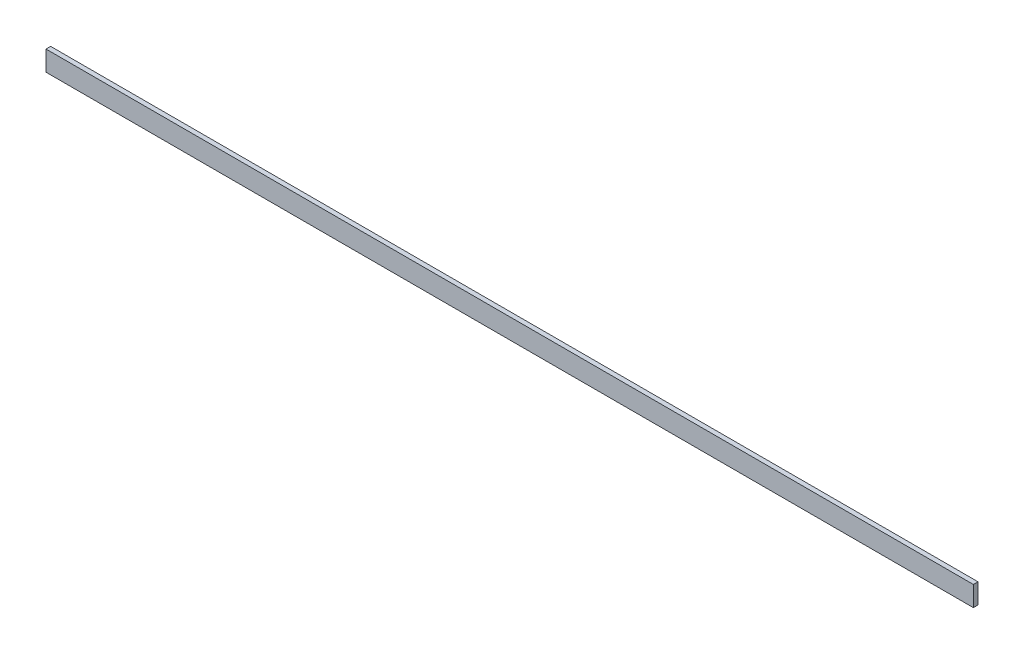
ISO-10303-21;
HEADER;
FILE_DESCRIPTION(('STEP AP214'),'2;1');
FILE_NAME('part.step','',(''),(''),'','','');
FILE_SCHEMA(('AUTOMOTIVE_DESIGN { 1 0 10303 214 1 1 1 1 }'));
ENDSEC;
DATA;
#1=APPLICATION_CONTEXT('core data for automotive mechanical design processes');
#2=APPLICATION_PROTOCOL_DEFINITION('international standard','automotive_design',2000,#1);
#3=PRODUCT_CONTEXT('',#1,'mechanical');
#4=PRODUCT('Part','Part','',(#3));
#5=PRODUCT_RELATED_PRODUCT_CATEGORY('part','',(#4));
#6=PRODUCT_DEFINITION_FORMATION('','',#4);
#7=PRODUCT_DEFINITION_CONTEXT('part definition',#1,'design');
#8=PRODUCT_DEFINITION('design','',#6,#7);
#9=PRODUCT_DEFINITION_SHAPE('','',#8);
#10=(LENGTH_UNIT() NAMED_UNIT(*) SI_UNIT(.MILLI.,.METRE.));
#11=(NAMED_UNIT(*) PLANE_ANGLE_UNIT() SI_UNIT($,.RADIAN.));
#12=(NAMED_UNIT(*) SI_UNIT($,.STERADIAN.) SOLID_ANGLE_UNIT());
#13=UNCERTAINTY_MEASURE_WITH_UNIT(LENGTH_MEASURE(1.E-05),#10,'distance_accuracy_value','');
#14=(GEOMETRIC_REPRESENTATION_CONTEXT(3) GLOBAL_UNCERTAINTY_ASSIGNED_CONTEXT((#13)) GLOBAL_UNIT_ASSIGNED_CONTEXT((#10,
#11,#12)) REPRESENTATION_CONTEXT('',''));
#15=CARTESIAN_POINT('',(0.,0.,0.));
#16=DIRECTION('',(0.,0.,1.));
#17=DIRECTION('',(1.,0.,0.));
#18=AXIS2_PLACEMENT_3D('',#15,#16,#17);
#19=CARTESIAN_POINT('',(300.000000000002,6.50000000000009,3.));
#20=DIRECTION('',(-1.,0.,0.));
#21=DIRECTION('',(0.,0.,1.));
#22=AXIS2_PLACEMENT_3D('',#19,#20,#21);
#23=PLANE('',#22);
#24=DIRECTION('',(0.,1.,0.));
#25=VECTOR('',#24,1.);
#26=CARTESIAN_POINT('',(300.000000000002,6.50000000000009,0.));
#27=LINE('',#26,#25);
#28=CARTESIAN_POINT('',(300.000000000002,-6.49999999999992,0.));
#29=VERTEX_POINT('',#28);
#30=CARTESIAN_POINT('',(300.000000000002,6.50000000000009,0.));
#31=VERTEX_POINT('',#30);
#32=EDGE_CURVE('E96',#29,#31,#27,.T.);
#33=ORIENTED_EDGE('',*,*,#32,.T.);
#34=DIRECTION('',(0.,0.,-1.));
#35=VECTOR('',#34,1.);
#36=CARTESIAN_POINT('',(300.000000000002,6.50000000000009,3.));
#37=LINE('',#36,#35);
#38=CARTESIAN_POINT('',(300.000000000002,6.50000000000009,3.));
#39=VERTEX_POINT('',#38);
#40=EDGE_CURVE('E11',#39,#31,#37,.T.);
#41=ORIENTED_EDGE('',*,*,#40,.F.);
#42=DIRECTION('',(0.,1.,0.));
#43=VECTOR('',#42,1.);
#44=CARTESIAN_POINT('',(300.000000000002,6.50000000000009,3.));
#45=LINE('',#44,#43);
#46=CARTESIAN_POINT('',(300.000000000002,-6.49999999999992,3.));
#47=VERTEX_POINT('',#46);
#48=EDGE_CURVE('E84',#47,#39,#45,.T.);
#49=ORIENTED_EDGE('',*,*,#48,.F.);
#50=DIRECTION('',(0.,0.,-1.));
#51=VECTOR('',#50,1.);
#52=CARTESIAN_POINT('',(300.000000000002,-6.49999999999992,3.));
#53=LINE('',#52,#51);
#54=EDGE_CURVE('E92',#47,#29,#53,.T.);
#55=ORIENTED_EDGE('',*,*,#54,.T.);
#56=EDGE_LOOP('',(#33,#41,#49,#55));
#57=FACE_BOUND('',#56,.T.);
#58=ADVANCED_FACE('F33',(#57),#23,.F.);
#59=CARTESIAN_POINT('',(-299.999999999998,6.50000000000009,3.));
#60=DIRECTION('',(0.,-1.,0.));
#61=DIRECTION('',(0.,0.,-1.));
#62=AXIS2_PLACEMENT_3D('',#59,#60,#61);
#63=PLANE('',#62);
#64=DIRECTION('',(-1.,0.,0.));
#65=VECTOR('',#64,1.);
#66=CARTESIAN_POINT('',(-299.999999999998,6.50000000000009,0.));
#67=LINE('',#66,#65);
#68=CARTESIAN_POINT('',(-299.999999999998,6.50000000000009,0.));
#69=VERTEX_POINT('',#68);
#70=EDGE_CURVE('E88',#31,#69,#67,.T.);
#71=ORIENTED_EDGE('',*,*,#70,.T.);
#72=DIRECTION('',(0.,0.,-1.));
#73=VECTOR('',#72,1.);
#74=CARTESIAN_POINT('',(-299.999999999998,6.50000000000009,3.));
#75=LINE('',#74,#73);
#76=CARTESIAN_POINT('',(-299.999999999998,6.50000000000009,3.));
#77=VERTEX_POINT('',#76);
#78=EDGE_CURVE('E41',#77,#69,#75,.T.);
#79=ORIENTED_EDGE('',*,*,#78,.F.);
#80=DIRECTION('',(-1.,0.,0.));
#81=VECTOR('',#80,1.);
#82=CARTESIAN_POINT('',(-299.999999999998,6.50000000000009,3.));
#83=LINE('',#82,#81);
#84=EDGE_CURVE('E79',#39,#77,#83,.T.);
#85=ORIENTED_EDGE('',*,*,#84,.F.);
#86=ORIENTED_EDGE('',*,*,#40,.T.);
#87=EDGE_LOOP('',(#71,#79,#85,#86));
#88=FACE_BOUND('',#87,.T.);
#89=ADVANCED_FACE('F87',(#88),#63,.F.);
#90=CARTESIAN_POINT('',(-299.999999999998,6.50000000000009,3.));
#91=DIRECTION('',(1.,0.,0.));
#92=DIRECTION('',(0.,1.,0.));
#93=AXIS2_PLACEMENT_3D('',#90,#91,#92);
#94=PLANE('',#93);
#95=DIRECTION('',(0.,-1.,0.));
#96=VECTOR('',#95,1.);
#97=CARTESIAN_POINT('',(-299.999999999998,6.50000000000009,0.));
#98=LINE('',#97,#96);
#99=CARTESIAN_POINT('',(-299.999999999998,-6.49999999999992,0.));
#100=VERTEX_POINT('',#99);
#101=EDGE_CURVE('E66',#69,#100,#98,.T.);
#102=ORIENTED_EDGE('',*,*,#101,.T.);
#103=DIRECTION('',(0.,0.,-1.));
#104=VECTOR('',#103,1.);
#105=CARTESIAN_POINT('',(-299.999999999998,-6.49999999999992,3.));
#106=LINE('',#105,#104);
#107=CARTESIAN_POINT('',(-299.999999999998,-6.49999999999992,3.));
#108=VERTEX_POINT('',#107);
#109=EDGE_CURVE('E89',#108,#100,#106,.T.);
#110=ORIENTED_EDGE('',*,*,#109,.F.);
#111=DIRECTION('',(0.,-1.,0.));
#112=VECTOR('',#111,1.);
#113=CARTESIAN_POINT('',(-299.999999999998,6.50000000000009,3.));
#114=LINE('',#113,#112);
#115=EDGE_CURVE('E82',#77,#108,#114,.T.);
#116=ORIENTED_EDGE('',*,*,#115,.F.);
#117=ORIENTED_EDGE('',*,*,#78,.T.);
#118=EDGE_LOOP('',(#102,#110,#116,#117));
#119=FACE_BOUND('',#118,.T.);
#120=ADVANCED_FACE('F90',(#119),#94,.F.);
#121=CARTESIAN_POINT('',(-299.999999999998,-6.49999999999992,3.));
#122=DIRECTION('',(0.,1.,0.));
#123=DIRECTION('',(0.,0.,1.));
#124=AXIS2_PLACEMENT_3D('',#121,#122,#123);
#125=PLANE('',#124);
#126=DIRECTION('',(1.,0.,0.));
#127=VECTOR('',#126,1.);
#128=CARTESIAN_POINT('',(-299.999999999998,-6.49999999999992,0.));
#129=LINE('',#128,#127);
#130=EDGE_CURVE('E72',#100,#29,#129,.T.);
#131=ORIENTED_EDGE('',*,*,#130,.T.);
#132=ORIENTED_EDGE('',*,*,#54,.F.);
#133=DIRECTION('',(1.,0.,0.));
#134=VECTOR('',#133,1.);
#135=CARTESIAN_POINT('',(-299.999999999998,-6.49999999999992,3.));
#136=LINE('',#135,#134);
#137=EDGE_CURVE('E49',#108,#47,#136,.T.);
#138=ORIENTED_EDGE('',*,*,#137,.F.);
#139=ORIENTED_EDGE('',*,*,#109,.T.);
#140=EDGE_LOOP('',(#131,#132,#138,#139));
#141=FACE_BOUND('',#140,.T.);
#142=ADVANCED_FACE('F103',(#141),#125,.F.);
#143=CARTESIAN_POINT('',(0.,0.,3.));
#144=DIRECTION('',(0.,0.,1.));
#145=DIRECTION('',(1.,0.,0.));
#146=AXIS2_PLACEMENT_3D('',#143,#144,#145);
#147=PLANE('',#146);
#148=ORIENTED_EDGE('',*,*,#48,.T.);
#149=ORIENTED_EDGE('',*,*,#84,.T.);
#150=ORIENTED_EDGE('',*,*,#115,.T.);
#151=ORIENTED_EDGE('',*,*,#137,.T.);
#152=EDGE_LOOP('',(#148,#149,#150,#151));
#153=FACE_BOUND('',#152,.T.);
#154=ADVANCED_FACE('F80',(#153),#147,.T.);
#155=CARTESIAN_POINT('',(0.,0.,0.));
#156=DIRECTION('',(0.,0.,1.));
#157=DIRECTION('',(1.,0.,0.));
#158=AXIS2_PLACEMENT_3D('',#155,#156,#157);
#159=PLANE('',#158);
#160=ORIENTED_EDGE('',*,*,#32,.F.);
#161=ORIENTED_EDGE('',*,*,#130,.F.);
#162=ORIENTED_EDGE('',*,*,#101,.F.);
#163=ORIENTED_EDGE('',*,*,#70,.F.);
#164=EDGE_LOOP('',(#160,#161,#162,#163));
#165=FACE_BOUND('',#164,.T.);
#166=ADVANCED_FACE('F106',(#165),#159,.F.);
#167=CLOSED_SHELL('',(#58,#89,#120,#142,#154,#166));
#168=MANIFOLD_SOLID_BREP('B2',#167);
#169=ADVANCED_BREP_SHAPE_REPRESENTATION('',(#18,#168),#14);
#170=SHAPE_DEFINITION_REPRESENTATION(#9,#169);
ENDSEC;
END-ISO-10303-21;
